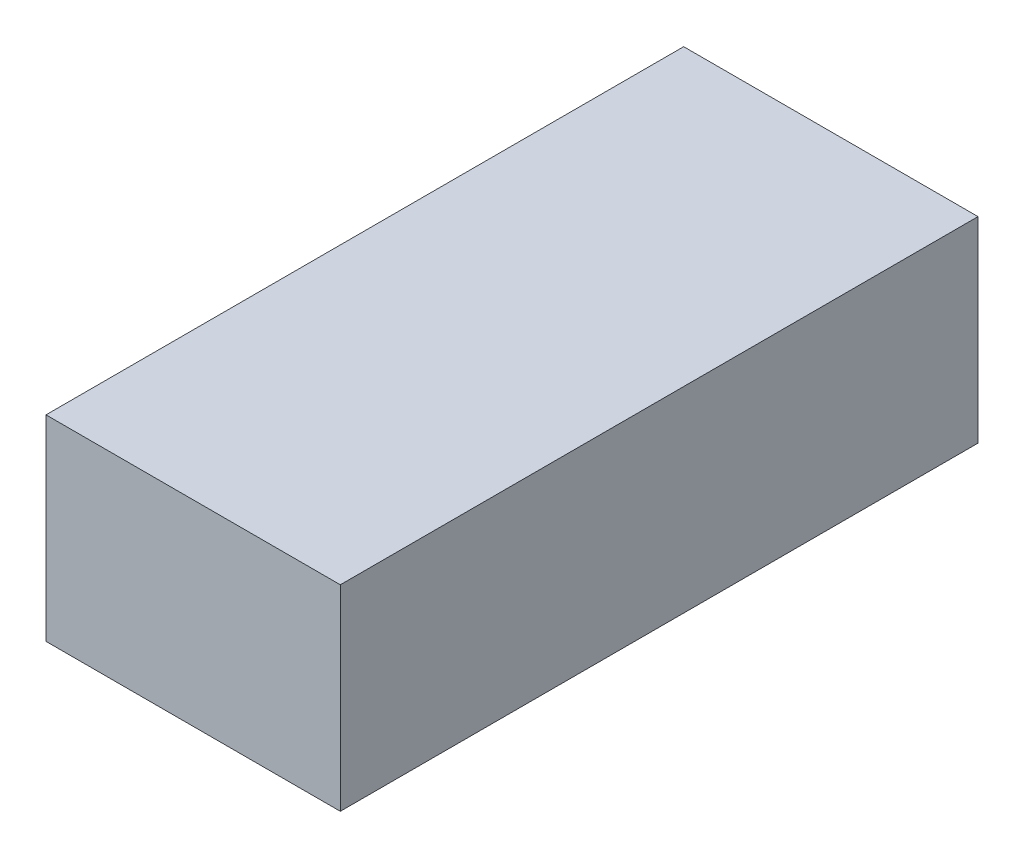
ISO-10303-21;
HEADER;
FILE_DESCRIPTION(('STEP AP214'),'2;1');
FILE_NAME('part.step','',(''),(''),'','','');
FILE_SCHEMA(('AUTOMOTIVE_DESIGN { 1 0 10303 214 1 1 1 1 }'));
ENDSEC;
DATA;
#1=APPLICATION_CONTEXT('core data for automotive mechanical design processes');
#2=APPLICATION_PROTOCOL_DEFINITION('international standard','automotive_design',2000,#1);
#3=PRODUCT_CONTEXT('',#1,'mechanical');
#4=PRODUCT('Part','Part','',(#3));
#5=PRODUCT_RELATED_PRODUCT_CATEGORY('part','',(#4));
#6=PRODUCT_DEFINITION_FORMATION('','',#4);
#7=PRODUCT_DEFINITION_CONTEXT('part definition',#1,'design');
#8=PRODUCT_DEFINITION('design','',#6,#7);
#9=PRODUCT_DEFINITION_SHAPE('','',#8);
#10=(LENGTH_UNIT() NAMED_UNIT(*) SI_UNIT(.MILLI.,.METRE.));
#11=(NAMED_UNIT(*) PLANE_ANGLE_UNIT() SI_UNIT($,.RADIAN.));
#12=(NAMED_UNIT(*) SI_UNIT($,.STERADIAN.) SOLID_ANGLE_UNIT());
#13=UNCERTAINTY_MEASURE_WITH_UNIT(LENGTH_MEASURE(1.E-05),#10,'distance_accuracy_value','');
#14=(GEOMETRIC_REPRESENTATION_CONTEXT(3) GLOBAL_UNCERTAINTY_ASSIGNED_CONTEXT((#13)) GLOBAL_UNIT_ASSIGNED_CONTEXT((#10,
#11,#12)) REPRESENTATION_CONTEXT('',''));
#15=CARTESIAN_POINT('',(0.,0.,0.));
#16=DIRECTION('',(0.,0.,1.));
#17=DIRECTION('',(1.,0.,0.));
#18=AXIS2_PLACEMENT_3D('',#15,#16,#17);
#19=CARTESIAN_POINT('',(-3.,2.,13.));
#20=DIRECTION('',(1.,0.,0.));
#21=DIRECTION('',(0.,1.,0.));
#22=AXIS2_PLACEMENT_3D('',#19,#20,#21);
#23=PLANE('',#22);
#24=DIRECTION('',(0.,-1.,0.));
#25=VECTOR('',#24,1.);
#26=CARTESIAN_POINT('',(-3.,2.,0.));
#27=LINE('',#26,#25);
#28=CARTESIAN_POINT('',(-3.,2.,0.));
#29=VERTEX_POINT('',#28);
#30=CARTESIAN_POINT('',(-3.,-2.,0.));
#31=VERTEX_POINT('',#30);
#32=EDGE_CURVE('E97',#29,#31,#27,.T.);
#33=ORIENTED_EDGE('',*,*,#32,.T.);
#34=DIRECTION('',(0.,0.,-1.));
#35=VECTOR('',#34,1.);
#36=CARTESIAN_POINT('',(-3.,-2.,13.));
#37=LINE('',#36,#35);
#38=CARTESIAN_POINT('',(-3.,-2.,13.));
#39=VERTEX_POINT('',#38);
#40=EDGE_CURVE('E11',#39,#31,#37,.T.);
#41=ORIENTED_EDGE('',*,*,#40,.F.);
#42=DIRECTION('',(0.,-1.,0.));
#43=VECTOR('',#42,1.);
#44=CARTESIAN_POINT('',(-3.,2.,13.));
#45=LINE('',#44,#43);
#46=CARTESIAN_POINT('',(-3.,2.,13.));
#47=VERTEX_POINT('',#46);
#48=EDGE_CURVE('E85',#47,#39,#45,.T.);
#49=ORIENTED_EDGE('',*,*,#48,.F.);
#50=DIRECTION('',(0.,0.,-1.));
#51=VECTOR('',#50,1.);
#52=CARTESIAN_POINT('',(-3.,2.,13.));
#53=LINE('',#52,#51);
#54=EDGE_CURVE('E93',#47,#29,#53,.T.);
#55=ORIENTED_EDGE('',*,*,#54,.T.);
#56=EDGE_LOOP('',(#33,#41,#49,#55));
#57=FACE_BOUND('',#56,.T.);
#58=ADVANCED_FACE('F34',(#57),#23,.F.);
#59=CARTESIAN_POINT('',(3.,-2.,13.));
#60=DIRECTION('',(0.,1.,0.));
#61=DIRECTION('',(-1.,0.,0.));
#62=AXIS2_PLACEMENT_3D('',#59,#60,#61);
#63=PLANE('',#62);
#64=DIRECTION('',(1.,0.,0.));
#65=VECTOR('',#64,1.);
#66=CARTESIAN_POINT('',(3.,-2.,0.));
#67=LINE('',#66,#65);
#68=CARTESIAN_POINT('',(3.,-2.,0.));
#69=VERTEX_POINT('',#68);
#70=EDGE_CURVE('E89',#31,#69,#67,.T.);
#71=ORIENTED_EDGE('',*,*,#70,.T.);
#72=DIRECTION('',(0.,0.,-1.));
#73=VECTOR('',#72,1.);
#74=CARTESIAN_POINT('',(3.,-2.,13.));
#75=LINE('',#74,#73);
#76=CARTESIAN_POINT('',(3.,-2.,13.));
#77=VERTEX_POINT('',#76);
#78=EDGE_CURVE('E42',#77,#69,#75,.T.);
#79=ORIENTED_EDGE('',*,*,#78,.F.);
#80=DIRECTION('',(1.,0.,0.));
#81=VECTOR('',#80,1.);
#82=CARTESIAN_POINT('',(3.,-2.,13.));
#83=LINE('',#82,#81);
#84=EDGE_CURVE('E80',#39,#77,#83,.T.);
#85=ORIENTED_EDGE('',*,*,#84,.F.);
#86=ORIENTED_EDGE('',*,*,#40,.T.);
#87=EDGE_LOOP('',(#71,#79,#85,#86));
#88=FACE_BOUND('',#87,.T.);
#89=ADVANCED_FACE('F88',(#88),#63,.F.);
#90=CARTESIAN_POINT('',(3.,2.,13.));
#91=DIRECTION('',(-1.,0.,0.));
#92=DIRECTION('',(0.,-1.,0.));
#93=AXIS2_PLACEMENT_3D('',#90,#91,#92);
#94=PLANE('',#93);
#95=DIRECTION('',(0.,1.,0.));
#96=VECTOR('',#95,1.);
#97=CARTESIAN_POINT('',(3.,2.,0.));
#98=LINE('',#97,#96);
#99=CARTESIAN_POINT('',(3.,2.,0.));
#100=VERTEX_POINT('',#99);
#101=EDGE_CURVE('E67',#69,#100,#98,.T.);
#102=ORIENTED_EDGE('',*,*,#101,.T.);
#103=DIRECTION('',(0.,0.,-1.));
#104=VECTOR('',#103,1.);
#105=CARTESIAN_POINT('',(3.,2.,13.));
#106=LINE('',#105,#104);
#107=CARTESIAN_POINT('',(3.,2.,13.));
#108=VERTEX_POINT('',#107);
#109=EDGE_CURVE('E90',#108,#100,#106,.T.);
#110=ORIENTED_EDGE('',*,*,#109,.F.);
#111=DIRECTION('',(0.,1.,0.));
#112=VECTOR('',#111,1.);
#113=CARTESIAN_POINT('',(3.,2.,13.));
#114=LINE('',#113,#112);
#115=EDGE_CURVE('E83',#77,#108,#114,.T.);
#116=ORIENTED_EDGE('',*,*,#115,.F.);
#117=ORIENTED_EDGE('',*,*,#78,.T.);
#118=EDGE_LOOP('',(#102,#110,#116,#117));
#119=FACE_BOUND('',#118,.T.);
#120=ADVANCED_FACE('F91',(#119),#94,.F.);
#121=CARTESIAN_POINT('',(3.,2.,13.));
#122=DIRECTION('',(0.,-1.,0.));
#123=DIRECTION('',(1.,0.,0.));
#124=AXIS2_PLACEMENT_3D('',#121,#122,#123);
#125=PLANE('',#124);
#126=DIRECTION('',(-1.,0.,0.));
#127=VECTOR('',#126,1.);
#128=CARTESIAN_POINT('',(3.,2.,0.));
#129=LINE('',#128,#127);
#130=EDGE_CURVE('E73',#100,#29,#129,.T.);
#131=ORIENTED_EDGE('',*,*,#130,.T.);
#132=ORIENTED_EDGE('',*,*,#54,.F.);
#133=DIRECTION('',(-1.,0.,0.));
#134=VECTOR('',#133,1.);
#135=CARTESIAN_POINT('',(3.,2.,13.));
#136=LINE('',#135,#134);
#137=EDGE_CURVE('E50',#108,#47,#136,.T.);
#138=ORIENTED_EDGE('',*,*,#137,.F.);
#139=ORIENTED_EDGE('',*,*,#109,.T.);
#140=EDGE_LOOP('',(#131,#132,#138,#139));
#141=FACE_BOUND('',#140,.T.);
#142=ADVANCED_FACE('F104',(#141),#125,.F.);
#143=CARTESIAN_POINT('',(0.,0.,13.));
#144=DIRECTION('',(0.,0.,-1.));
#145=DIRECTION('',(-1.,0.,0.));
#146=AXIS2_PLACEMENT_3D('',#143,#144,#145);
#147=PLANE('',#146);
#148=ORIENTED_EDGE('',*,*,#48,.T.);
#149=ORIENTED_EDGE('',*,*,#84,.T.);
#150=ORIENTED_EDGE('',*,*,#115,.T.);
#151=ORIENTED_EDGE('',*,*,#137,.T.);
#152=EDGE_LOOP('',(#148,#149,#150,#151));
#153=FACE_BOUND('',#152,.T.);
#154=ADVANCED_FACE('F81',(#153),#147,.F.);
#155=CARTESIAN_POINT('',(0.,0.,0.));
#156=DIRECTION('',(0.,0.,-1.));
#157=DIRECTION('',(-1.,0.,0.));
#158=AXIS2_PLACEMENT_3D('',#155,#156,#157);
#159=PLANE('',#158);
#160=ORIENTED_EDGE('',*,*,#32,.F.);
#161=ORIENTED_EDGE('',*,*,#130,.F.);
#162=ORIENTED_EDGE('',*,*,#101,.F.);
#163=ORIENTED_EDGE('',*,*,#70,.F.);
#164=EDGE_LOOP('',(#160,#161,#162,#163));
#165=FACE_BOUND('',#164,.T.);
#166=ADVANCED_FACE('F107',(#165),#159,.T.);
#167=CLOSED_SHELL('',(#58,#89,#120,#142,#154,#166));
#168=MANIFOLD_SOLID_BREP('B2',#167);
#169=ADVANCED_BREP_SHAPE_REPRESENTATION('',(#18,#168),#14);
#170=SHAPE_DEFINITION_REPRESENTATION(#9,#169);
ENDSEC;
END-ISO-10303-21;
